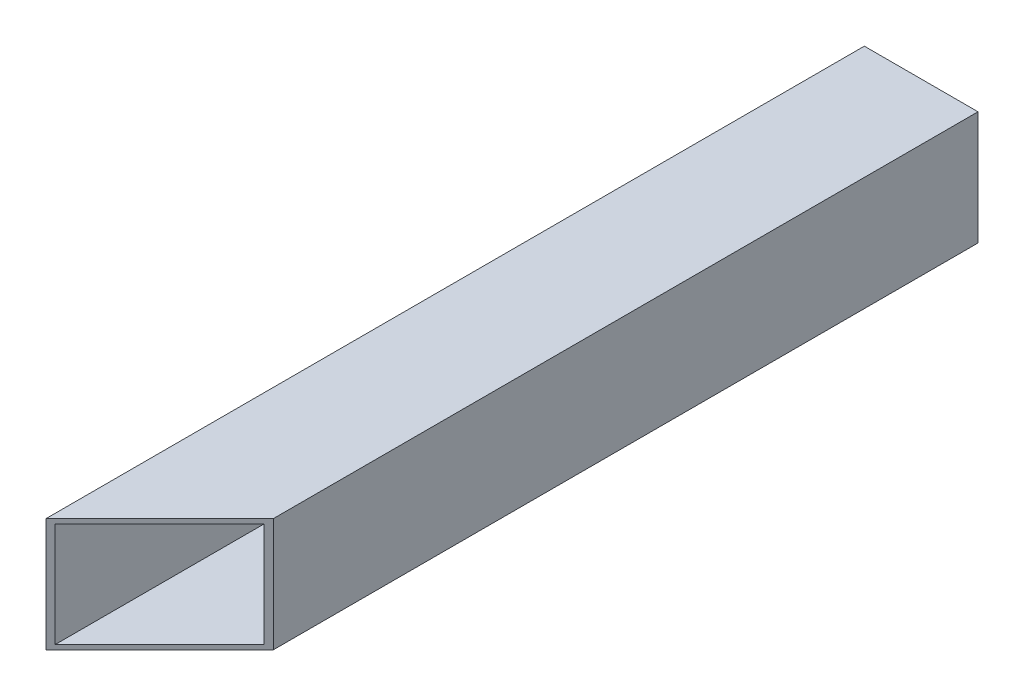
ISO-10303-21;
HEADER;
FILE_DESCRIPTION(('STEP AP214'),'2;1');
FILE_NAME('part.step','',(''),(''),'','','');
FILE_SCHEMA(('AUTOMOTIVE_DESIGN { 1 0 10303 214 1 1 1 1 }'));
ENDSEC;
DATA;
#1=APPLICATION_CONTEXT('core data for automotive mechanical design processes');
#2=APPLICATION_PROTOCOL_DEFINITION('international standard','automotive_design',2000,#1);
#3=PRODUCT_CONTEXT('',#1,'mechanical');
#4=PRODUCT('Part','Part','',(#3));
#5=PRODUCT_RELATED_PRODUCT_CATEGORY('part','',(#4));
#6=PRODUCT_DEFINITION_FORMATION('','',#4);
#7=PRODUCT_DEFINITION_CONTEXT('part definition',#1,'design');
#8=PRODUCT_DEFINITION('design','',#6,#7);
#9=PRODUCT_DEFINITION_SHAPE('','',#8);
#10=(LENGTH_UNIT() NAMED_UNIT(*) SI_UNIT(.MILLI.,.METRE.));
#11=(NAMED_UNIT(*) PLANE_ANGLE_UNIT() SI_UNIT($,.RADIAN.));
#12=(NAMED_UNIT(*) SI_UNIT($,.STERADIAN.) SOLID_ANGLE_UNIT());
#13=UNCERTAINTY_MEASURE_WITH_UNIT(LENGTH_MEASURE(1.E-05),#10,'distance_accuracy_value','');
#14=(GEOMETRIC_REPRESENTATION_CONTEXT(3) GLOBAL_UNCERTAINTY_ASSIGNED_CONTEXT((#13)) GLOBAL_UNIT_ASSIGNED_CONTEXT((#10,
#11,#12)) REPRESENTATION_CONTEXT('',''));
#15=CARTESIAN_POINT('',(0.,0.,0.));
#16=DIRECTION('',(0.,0.,1.));
#17=DIRECTION('',(1.,0.,0.));
#18=AXIS2_PLACEMENT_3D('',#15,#16,#17);
#19=CARTESIAN_POINT('',(0.,0.,0.));
#20=DIRECTION('',(0.,0.,1.));
#21=DIRECTION('',(1.,0.,0.));
#22=AXIS2_PLACEMENT_3D('',#19,#20,#21);
#23=PLANE('',#22);
#24=DIRECTION('',(0.,-1.,0.));
#25=VECTOR('',#24,1.);
#26=CARTESIAN_POINT('',(-12.5,-12.5,0.));
#27=LINE('',#26,#25);
#28=CARTESIAN_POINT('',(-12.5,12.5,0.));
#29=VERTEX_POINT('',#28);
#30=CARTESIAN_POINT('',(-12.5,-12.5,0.));
#31=VERTEX_POINT('',#30);
#32=EDGE_CURVE('E128',#29,#31,#27,.T.);
#33=ORIENTED_EDGE('',*,*,#32,.F.);
#34=DIRECTION('',(-1.,0.,0.));
#35=VECTOR('',#34,1.);
#36=CARTESIAN_POINT('',(12.5,12.5,0.));
#37=LINE('',#36,#35);
#38=CARTESIAN_POINT('',(12.5,12.5,0.));
#39=VERTEX_POINT('',#38);
#40=EDGE_CURVE('E113',#39,#29,#37,.T.);
#41=ORIENTED_EDGE('',*,*,#40,.F.);
#42=DIRECTION('',(0.,1.,0.));
#43=VECTOR('',#42,1.);
#44=CARTESIAN_POINT('',(12.5,-12.5,0.));
#45=LINE('',#44,#43);
#46=CARTESIAN_POINT('',(12.5,-12.5,0.));
#47=VERTEX_POINT('',#46);
#48=EDGE_CURVE('E122',#47,#39,#45,.T.);
#49=ORIENTED_EDGE('',*,*,#48,.F.);
#50=DIRECTION('',(1.,0.,0.));
#51=VECTOR('',#50,1.);
#52=CARTESIAN_POINT('',(12.5,-12.5,0.));
#53=LINE('',#52,#51);
#54=EDGE_CURVE('E130',#31,#47,#53,.T.);
#55=ORIENTED_EDGE('',*,*,#54,.F.);
#56=EDGE_LOOP('',(#33,#41,#49,#55));
#57=FACE_BOUND('',#56,.T.);
#58=DIRECTION('',(0.,-1.,0.));
#59=VECTOR('',#58,1.);
#60=CARTESIAN_POINT('',(-11.5,-11.5,0.));
#61=LINE('',#60,#59);
#62=CARTESIAN_POINT('',(-11.5,11.5,0.));
#63=VERTEX_POINT('',#62);
#64=CARTESIAN_POINT('',(-11.5,-11.5,0.));
#65=VERTEX_POINT('',#64);
#66=EDGE_CURVE('E154',#63,#65,#61,.T.);
#67=ORIENTED_EDGE('',*,*,#66,.T.);
#68=DIRECTION('',(1.,0.,0.));
#69=VECTOR('',#68,1.);
#70=CARTESIAN_POINT('',(11.5,-11.5,0.));
#71=LINE('',#70,#69);
#72=CARTESIAN_POINT('',(11.5,-11.5,0.));
#73=VERTEX_POINT('',#72);
#74=EDGE_CURVE('E157',#65,#73,#71,.T.);
#75=ORIENTED_EDGE('',*,*,#74,.T.);
#76=DIRECTION('',(0.,1.,0.));
#77=VECTOR('',#76,1.);
#78=CARTESIAN_POINT('',(11.5,-11.5,0.));
#79=LINE('',#78,#77);
#80=CARTESIAN_POINT('',(11.5,11.5,0.));
#81=VERTEX_POINT('',#80);
#82=EDGE_CURVE('E160',#73,#81,#79,.T.);
#83=ORIENTED_EDGE('',*,*,#82,.T.);
#84=DIRECTION('',(-1.,0.,0.));
#85=VECTOR('',#84,1.);
#86=CARTESIAN_POINT('',(11.5,11.5,0.));
#87=LINE('',#86,#85);
#88=EDGE_CURVE('E163',#81,#63,#87,.T.);
#89=ORIENTED_EDGE('',*,*,#88,.T.);
#90=EDGE_LOOP('',(#67,#75,#83,#89));
#91=FACE_BOUND('',#90,.T.);
#92=ADVANCED_FACE('F39',(#57,#91),#23,.F.);
#93=CARTESIAN_POINT('',(-12.5,-12.5,180.));
#94=DIRECTION('',(1.,0.,0.));
#95=DIRECTION('',(0.,1.,0.));
#96=AXIS2_PLACEMENT_3D('',#93,#94,#95);
#97=PLANE('',#96);
#98=ORIENTED_EDGE('',*,*,#32,.T.);
#99=DIRECTION('',(0.,0.,-1.));
#100=VECTOR('',#99,1.);
#101=CARTESIAN_POINT('',(-12.5,-12.5,180.));
#102=LINE('',#101,#100);
#103=CARTESIAN_POINT('',(-12.5,-12.5,180.));
#104=VERTEX_POINT('',#103);
#105=EDGE_CURVE('E47',#104,#31,#102,.T.);
#106=ORIENTED_EDGE('',*,*,#105,.F.);
#107=DIRECTION('',(0.,-1.,0.));
#108=VECTOR('',#107,1.);
#109=CARTESIAN_POINT('',(-12.5,-12.5,180.));
#110=LINE('',#109,#108);
#111=CARTESIAN_POINT('',(-12.5,12.5,180.));
#112=VERTEX_POINT('',#111);
#113=EDGE_CURVE('E104',#112,#104,#110,.T.);
#114=ORIENTED_EDGE('',*,*,#113,.F.);
#115=DIRECTION('',(0.,0.,-1.));
#116=VECTOR('',#115,1.);
#117=CARTESIAN_POINT('',(-12.5,12.5,180.));
#118=LINE('',#117,#116);
#119=EDGE_CURVE('E110',#112,#29,#118,.T.);
#120=ORIENTED_EDGE('',*,*,#119,.T.);
#121=EDGE_LOOP('',(#98,#106,#114,#120));
#122=FACE_BOUND('',#121,.T.);
#123=ADVANCED_FACE('F41',(#122),#97,.F.);
#124=CARTESIAN_POINT('',(12.5,-12.5,180.));
#125=DIRECTION('',(0.,1.,0.));
#126=DIRECTION('',(-1.,0.,0.));
#127=AXIS2_PLACEMENT_3D('',#124,#125,#126);
#128=PLANE('',#127);
#129=DIRECTION('',(0.,0.,-1.));
#130=VECTOR('',#129,1.);
#131=CARTESIAN_POINT('',(12.5,-12.5,180.));
#132=LINE('',#131,#130);
#133=CARTESIAN_POINT('',(12.5,-12.5,155.));
#134=VERTEX_POINT('',#133);
#135=EDGE_CURVE('E136',#134,#47,#132,.T.);
#136=ORIENTED_EDGE('',*,*,#135,.F.);
#137=DIRECTION('',(-0.707106781186551,0.,0.707106781186544));
#138=VECTOR('',#137,1.);
#139=CARTESIAN_POINT('',(1.31838984174237E-13,-12.5,167.5));
#140=LINE('',#139,#138);
#141=EDGE_CURVE('E141',#134,#104,#140,.T.);
#142=ORIENTED_EDGE('',*,*,#141,.T.);
#143=ORIENTED_EDGE('',*,*,#105,.T.);
#144=ORIENTED_EDGE('',*,*,#54,.T.);
#145=EDGE_LOOP('',(#136,#142,#143,#144));
#146=FACE_BOUND('',#145,.T.);
#147=ADVANCED_FACE('F139',(#146),#128,.F.);
#148=CARTESIAN_POINT('',(12.5,-12.5,180.));
#149=DIRECTION('',(-1.,0.,0.));
#150=DIRECTION('',(0.,0.,1.));
#151=AXIS2_PLACEMENT_3D('',#148,#149,#150);
#152=PLANE('',#151);
#153=DIRECTION('',(0.,0.,-1.));
#154=VECTOR('',#153,1.);
#155=CARTESIAN_POINT('',(12.5,12.5,180.));
#156=LINE('',#155,#154);
#157=CARTESIAN_POINT('',(12.5,12.5,155.));
#158=VERTEX_POINT('',#157);
#159=EDGE_CURVE('E117',#158,#39,#156,.T.);
#160=ORIENTED_EDGE('',*,*,#159,.F.);
#161=DIRECTION('',(0.,1.,0.));
#162=VECTOR('',#161,1.);
#163=CARTESIAN_POINT('',(12.5,-197.5,155.));
#164=LINE('',#163,#162);
#165=EDGE_CURVE('E54',#134,#158,#164,.T.);
#166=ORIENTED_EDGE('',*,*,#165,.F.);
#167=ORIENTED_EDGE('',*,*,#135,.T.);
#168=ORIENTED_EDGE('',*,*,#48,.T.);
#169=EDGE_LOOP('',(#160,#166,#167,#168));
#170=FACE_BOUND('',#169,.T.);
#171=ADVANCED_FACE('F145',(#170),#152,.F.);
#172=CARTESIAN_POINT('',(12.5,12.5,180.));
#173=DIRECTION('',(0.,-1.,0.));
#174=DIRECTION('',(0.,0.,-1.));
#175=AXIS2_PLACEMENT_3D('',#172,#173,#174);
#176=PLANE('',#175);
#177=ORIENTED_EDGE('',*,*,#119,.F.);
#178=DIRECTION('',(-0.707106781186551,0.,0.707106781186544));
#179=VECTOR('',#178,1.);
#180=CARTESIAN_POINT('',(12.5,12.5,155.));
#181=LINE('',#180,#179);
#182=EDGE_CURVE('E100',#158,#112,#181,.T.);
#183=ORIENTED_EDGE('',*,*,#182,.F.);
#184=ORIENTED_EDGE('',*,*,#159,.T.);
#185=ORIENTED_EDGE('',*,*,#40,.T.);
#186=EDGE_LOOP('',(#177,#183,#184,#185));
#187=FACE_BOUND('',#186,.T.);
#188=ADVANCED_FACE('F111',(#187),#176,.F.);
#189=CARTESIAN_POINT('',(-11.5,-11.5,180.));
#190=DIRECTION('',(1.,0.,0.));
#191=DIRECTION('',(0.,0.,-1.));
#192=AXIS2_PLACEMENT_3D('',#189,#190,#191);
#193=PLANE('',#192);
#194=DIRECTION('',(0.,1.,0.));
#195=VECTOR('',#194,1.);
#196=CARTESIAN_POINT('',(-11.5,-11.5,179.));
#197=LINE('',#196,#195);
#198=CARTESIAN_POINT('',(-11.5,-11.5,179.));
#199=VERTEX_POINT('',#198);
#200=CARTESIAN_POINT('',(-11.5,11.5,179.));
#201=VERTEX_POINT('',#200);
#202=EDGE_CURVE('E61',#199,#201,#197,.T.);
#203=ORIENTED_EDGE('',*,*,#202,.F.);
#204=DIRECTION('',(0.,0.,-1.));
#205=VECTOR('',#204,1.);
#206=CARTESIAN_POINT('',(-11.5,-11.5,180.));
#207=LINE('',#206,#205);
#208=EDGE_CURVE('E126',#199,#65,#207,.T.);
#209=ORIENTED_EDGE('',*,*,#208,.T.);
#210=ORIENTED_EDGE('',*,*,#66,.F.);
#211=DIRECTION('',(0.,0.,-1.));
#212=VECTOR('',#211,1.);
#213=CARTESIAN_POINT('',(-11.5,11.5,180.));
#214=LINE('',#213,#212);
#215=EDGE_CURVE('E166',#201,#63,#214,.T.);
#216=ORIENTED_EDGE('',*,*,#215,.F.);
#217=EDGE_LOOP('',(#203,#209,#210,#216));
#218=FACE_BOUND('',#217,.T.);
#219=ADVANCED_FACE('F178',(#218),#193,.T.);
#220=CARTESIAN_POINT('',(11.5,-11.5,180.));
#221=DIRECTION('',(0.,1.,0.));
#222=DIRECTION('',(0.,0.,1.));
#223=AXIS2_PLACEMENT_3D('',#220,#221,#222);
#224=PLANE('',#223);
#225=DIRECTION('',(-0.707106781186551,0.,0.707106781186544));
#226=VECTOR('',#225,1.);
#227=CARTESIAN_POINT('',(-0.499999999999874,-11.5,168.));
#228=LINE('',#227,#226);
#229=CARTESIAN_POINT('',(11.5,-11.5,156.));
#230=VERTEX_POINT('',#229);
#231=EDGE_CURVE('E148',#230,#199,#228,.T.);
#232=ORIENTED_EDGE('',*,*,#231,.F.);
#233=DIRECTION('',(0.,0.,-1.));
#234=VECTOR('',#233,1.);
#235=CARTESIAN_POINT('',(11.5,-11.5,180.));
#236=LINE('',#235,#234);
#237=EDGE_CURVE('E169',#230,#73,#236,.T.);
#238=ORIENTED_EDGE('',*,*,#237,.T.);
#239=ORIENTED_EDGE('',*,*,#74,.F.);
#240=ORIENTED_EDGE('',*,*,#208,.F.);
#241=EDGE_LOOP('',(#232,#238,#239,#240));
#242=FACE_BOUND('',#241,.T.);
#243=ADVANCED_FACE('F180',(#242),#224,.T.);
#244=CARTESIAN_POINT('',(11.5,-11.5,180.));
#245=DIRECTION('',(-1.,0.,0.));
#246=DIRECTION('',(0.,0.,1.));
#247=AXIS2_PLACEMENT_3D('',#244,#245,#246);
#248=PLANE('',#247);
#249=DIRECTION('',(0.,-1.,0.));
#250=VECTOR('',#249,1.);
#251=CARTESIAN_POINT('',(11.5,-11.5,156.));
#252=LINE('',#251,#250);
#253=CARTESIAN_POINT('',(11.5,11.5,156.));
#254=VERTEX_POINT('',#253);
#255=EDGE_CURVE('E146',#254,#230,#252,.T.);
#256=ORIENTED_EDGE('',*,*,#255,.F.);
#257=DIRECTION('',(0.,0.,-1.));
#258=VECTOR('',#257,1.);
#259=CARTESIAN_POINT('',(11.5,11.5,180.));
#260=LINE('',#259,#258);
#261=EDGE_CURVE('E168',#254,#81,#260,.T.);
#262=ORIENTED_EDGE('',*,*,#261,.T.);
#263=ORIENTED_EDGE('',*,*,#82,.F.);
#264=ORIENTED_EDGE('',*,*,#237,.F.);
#265=EDGE_LOOP('',(#256,#262,#263,#264));
#266=FACE_BOUND('',#265,.T.);
#267=ADVANCED_FACE('F187',(#266),#248,.T.);
#268=CARTESIAN_POINT('',(11.5,11.5,180.));
#269=DIRECTION('',(0.,-1.,0.));
#270=DIRECTION('',(0.,0.,-1.));
#271=AXIS2_PLACEMENT_3D('',#268,#269,#270);
#272=PLANE('',#271);
#273=DIRECTION('',(0.707106781186551,0.,-0.707106781186544));
#274=VECTOR('',#273,1.);
#275=CARTESIAN_POINT('',(-0.499999999999874,11.5,168.));
#276=LINE('',#275,#274);
#277=EDGE_CURVE('E11',#201,#254,#276,.T.);
#278=ORIENTED_EDGE('',*,*,#277,.F.);
#279=ORIENTED_EDGE('',*,*,#215,.T.);
#280=ORIENTED_EDGE('',*,*,#88,.F.);
#281=ORIENTED_EDGE('',*,*,#261,.F.);
#282=EDGE_LOOP('',(#278,#279,#280,#281));
#283=FACE_BOUND('',#282,.T.);
#284=ADVANCED_FACE('F184',(#283),#272,.T.);
#285=CARTESIAN_POINT('',(12.5,-197.5,155.));
#286=DIRECTION('',(-0.707106781186544,0.,-0.707106781186551));
#287=DIRECTION('',(-0.707106781186551,0.,0.707106781186544));
#288=AXIS2_PLACEMENT_3D('',#285,#286,#287);
#289=PLANE('',#288);
#290=ORIENTED_EDGE('',*,*,#202,.T.);
#291=ORIENTED_EDGE('',*,*,#277,.T.);
#292=ORIENTED_EDGE('',*,*,#255,.T.);
#293=ORIENTED_EDGE('',*,*,#231,.T.);
#294=EDGE_LOOP('',(#290,#291,#292,#293));
#295=FACE_BOUND('',#294,.T.);
#296=ORIENTED_EDGE('',*,*,#165,.T.);
#297=ORIENTED_EDGE('',*,*,#182,.T.);
#298=ORIENTED_EDGE('',*,*,#113,.T.);
#299=ORIENTED_EDGE('',*,*,#141,.F.);
#300=EDGE_LOOP('',(#296,#297,#298,#299));
#301=FACE_BOUND('',#300,.T.);
#302=ADVANCED_FACE('F102',(#295,#301),#289,.F.);
#303=CLOSED_SHELL('',(#92,#123,#147,#171,#188,#219,#243,#267,#284,#302));
#304=MANIFOLD_SOLID_BREP('B2',#303);
#305=ADVANCED_BREP_SHAPE_REPRESENTATION('',(#18,#304),#14);
#306=SHAPE_DEFINITION_REPRESENTATION(#9,#305);
ENDSEC;
END-ISO-10303-21;
